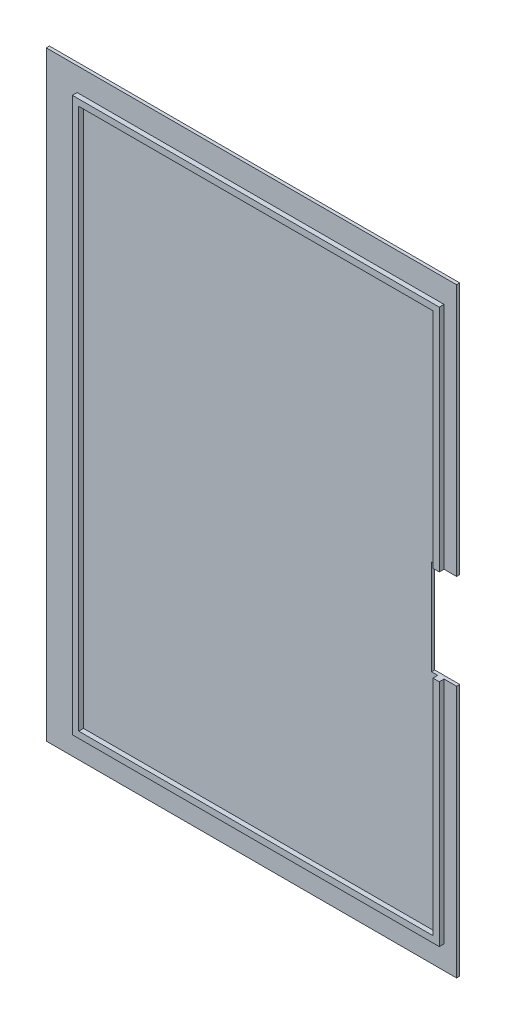
ISO-10303-21;
HEADER;
FILE_DESCRIPTION(('STEP AP214'),'2;1');
FILE_NAME('part.step','',(''),(''),'','','');
FILE_SCHEMA(('AUTOMOTIVE_DESIGN { 1 0 10303 214 1 1 1 1 }'));
ENDSEC;
DATA;
#1=APPLICATION_CONTEXT('core data for automotive mechanical design processes');
#2=APPLICATION_PROTOCOL_DEFINITION('international standard','automotive_design',2000,#1);
#3=PRODUCT_CONTEXT('',#1,'mechanical');
#4=PRODUCT('Part','Part','',(#3));
#5=PRODUCT_RELATED_PRODUCT_CATEGORY('part','',(#4));
#6=PRODUCT_DEFINITION_FORMATION('','',#4);
#7=PRODUCT_DEFINITION_CONTEXT('part definition',#1,'design');
#8=PRODUCT_DEFINITION('design','',#6,#7);
#9=PRODUCT_DEFINITION_SHAPE('','',#8);
#10=(LENGTH_UNIT() NAMED_UNIT(*) SI_UNIT(.MILLI.,.METRE.));
#11=(NAMED_UNIT(*) PLANE_ANGLE_UNIT() SI_UNIT($,.RADIAN.));
#12=(NAMED_UNIT(*) SI_UNIT($,.STERADIAN.) SOLID_ANGLE_UNIT());
#13=UNCERTAINTY_MEASURE_WITH_UNIT(LENGTH_MEASURE(1.E-05),#10,'distance_accuracy_value','');
#14=(GEOMETRIC_REPRESENTATION_CONTEXT(3) GLOBAL_UNCERTAINTY_ASSIGNED_CONTEXT((#13)) GLOBAL_UNIT_ASSIGNED_CONTEXT((#10,
#11,#12)) REPRESENTATION_CONTEXT('',''));
#15=CARTESIAN_POINT('',(0.,0.,0.));
#16=DIRECTION('',(0.,0.,1.));
#17=DIRECTION('',(1.,0.,0.));
#18=AXIS2_PLACEMENT_3D('',#15,#16,#17);
#19=CARTESIAN_POINT('',(64.75,94.75,1.));
#20=DIRECTION('',(-1.,0.,0.));
#21=DIRECTION('',(0.,0.,1.));
#22=AXIS2_PLACEMENT_3D('',#19,#20,#21);
#23=PLANE('',#22);
#24=DIRECTION('',(0.,1.,0.));
#25=VECTOR('',#24,1.);
#26=CARTESIAN_POINT('',(64.75,94.75,0.));
#27=LINE('',#26,#25);
#28=CARTESIAN_POINT('',(64.75,-94.75,0.));
#29=VERTEX_POINT('',#28);
#30=CARTESIAN_POINT('',(64.75,-15.,0.));
#31=VERTEX_POINT('',#30);
#32=EDGE_CURVE('E238',#29,#31,#27,.T.);
#33=ORIENTED_EDGE('',*,*,#32,.T.);
#34=DIRECTION('',(0.,0.,1.));
#35=VECTOR('',#34,1.);
#36=CARTESIAN_POINT('',(64.75,-15.,-0.5));
#37=LINE('',#36,#35);
#38=CARTESIAN_POINT('',(64.75,-15.,1.));
#39=VERTEX_POINT('',#38);
#40=EDGE_CURVE('E276',#31,#39,#37,.T.);
#41=ORIENTED_EDGE('',*,*,#40,.T.);
#42=DIRECTION('',(0.,1.,0.));
#43=VECTOR('',#42,1.);
#44=CARTESIAN_POINT('',(64.75,94.75,1.));
#45=LINE('',#44,#43);
#46=CARTESIAN_POINT('',(64.75,-94.75,1.));
#47=VERTEX_POINT('',#46);
#48=EDGE_CURVE('E227',#47,#39,#45,.T.);
#49=ORIENTED_EDGE('',*,*,#48,.F.);
#50=DIRECTION('',(0.,0.,-1.));
#51=VECTOR('',#50,1.);
#52=CARTESIAN_POINT('',(64.75,-94.75,1.));
#53=LINE('',#52,#51);
#54=EDGE_CURVE('E237',#47,#29,#53,.T.);
#55=ORIENTED_EDGE('',*,*,#54,.T.);
#56=EDGE_LOOP('',(#33,#41,#49,#55));
#57=FACE_BOUND('',#56,.T.);
#58=ADVANCED_FACE('F36',(#57),#23,.F.);
#59=CARTESIAN_POINT('',(60.8,87.4,2.5));
#60=DIRECTION('',(-1.,0.,0.));
#61=DIRECTION('',(0.,0.,1.));
#62=AXIS2_PLACEMENT_3D('',#59,#60,#61);
#63=PLANE('',#62);
#64=DIRECTION('',(0.,1.,0.));
#65=VECTOR('',#64,1.);
#66=CARTESIAN_POINT('',(60.8,87.4,1.));
#67=LINE('',#66,#65);
#68=CARTESIAN_POINT('',(60.8,-87.4,1.));
#69=VERTEX_POINT('',#68);
#70=CARTESIAN_POINT('',(60.8,-15.,1.));
#71=VERTEX_POINT('',#70);
#72=EDGE_CURVE('E212',#69,#71,#67,.T.);
#73=ORIENTED_EDGE('',*,*,#72,.T.);
#74=DIRECTION('',(0.,0.,1.));
#75=VECTOR('',#74,1.);
#76=CARTESIAN_POINT('',(60.8,-15.,2.5));
#77=LINE('',#76,#75);
#78=CARTESIAN_POINT('',(60.8,-15.,2.5));
#79=VERTEX_POINT('',#78);
#80=EDGE_CURVE('E331',#71,#79,#77,.T.);
#81=ORIENTED_EDGE('',*,*,#80,.T.);
#82=DIRECTION('',(0.,1.,0.));
#83=VECTOR('',#82,1.);
#84=CARTESIAN_POINT('',(60.8,87.4,2.5));
#85=LINE('',#84,#83);
#86=CARTESIAN_POINT('',(60.8,-87.4,2.5));
#87=VERTEX_POINT('',#86);
#88=EDGE_CURVE('E195',#87,#79,#85,.T.);
#89=ORIENTED_EDGE('',*,*,#88,.F.);
#90=DIRECTION('',(0.,0.,-1.));
#91=VECTOR('',#90,1.);
#92=CARTESIAN_POINT('',(60.8,-87.4,2.5));
#93=LINE('',#92,#91);
#94=EDGE_CURVE('E211',#87,#69,#93,.T.);
#95=ORIENTED_EDGE('',*,*,#94,.T.);
#96=EDGE_LOOP('',(#73,#81,#89,#95));
#97=FACE_BOUND('',#96,.T.);
#98=ADVANCED_FACE('F330',(#97),#63,.F.);
#99=CARTESIAN_POINT('',(58.8,85.4,2.5));
#100=DIRECTION('',(-1.,0.,0.));
#101=DIRECTION('',(0.,0.,1.));
#102=AXIS2_PLACEMENT_3D('',#99,#100,#101);
#103=PLANE('',#102);
#104=DIRECTION('',(0.,0.,1.));
#105=VECTOR('',#104,1.);
#106=CARTESIAN_POINT('',(58.8,-15.,2.5));
#107=LINE('',#106,#105);
#108=CARTESIAN_POINT('',(58.8,-15.,1.));
#109=VERTEX_POINT('',#108);
#110=CARTESIAN_POINT('',(58.8,-15.,2.5));
#111=VERTEX_POINT('',#110);
#112=EDGE_CURVE('E333',#109,#111,#107,.T.);
#113=ORIENTED_EDGE('',*,*,#112,.F.);
#114=DIRECTION('',(0.,1.,0.));
#115=VECTOR('',#114,1.);
#116=CARTESIAN_POINT('',(58.8,85.4,1.));
#117=LINE('',#116,#115);
#118=CARTESIAN_POINT('',(58.8,-85.4,1.));
#119=VERTEX_POINT('',#118);
#120=EDGE_CURVE('E281',#119,#109,#117,.T.);
#121=ORIENTED_EDGE('',*,*,#120,.F.);
#122=DIRECTION('',(0.,0.,-1.));
#123=VECTOR('',#122,1.);
#124=CARTESIAN_POINT('',(58.8,-85.4,2.5));
#125=LINE('',#124,#123);
#126=CARTESIAN_POINT('',(58.8,-85.4,2.5));
#127=VERTEX_POINT('',#126);
#128=EDGE_CURVE('E298',#127,#119,#125,.T.);
#129=ORIENTED_EDGE('',*,*,#128,.F.);
#130=DIRECTION('',(0.,1.,0.));
#131=VECTOR('',#130,1.);
#132=CARTESIAN_POINT('',(58.8,85.4,2.5));
#133=LINE('',#132,#131);
#134=EDGE_CURVE('E341',#127,#111,#133,.T.);
#135=ORIENTED_EDGE('',*,*,#134,.T.);
#136=EDGE_LOOP('',(#113,#121,#129,#135));
#137=FACE_BOUND('',#136,.T.);
#138=ADVANCED_FACE('F353',(#137),#103,.T.);
#139=CARTESIAN_POINT('',(0.,0.,1.));
#140=DIRECTION('',(0.,0.,1.));
#141=DIRECTION('',(1.,0.,0.));
#142=AXIS2_PLACEMENT_3D('',#139,#140,#141);
#143=PLANE('',#142);
#144=DIRECTION('',(1.,0.,0.));
#145=VECTOR('',#144,1.);
#146=CARTESIAN_POINT('',(0.,-15.,1.));
#147=LINE('',#146,#145);
#148=EDGE_CURVE('E332',#71,#39,#147,.T.);
#149=ORIENTED_EDGE('',*,*,#148,.F.);
#150=ORIENTED_EDGE('',*,*,#72,.F.);
#151=DIRECTION('',(1.,0.,0.));
#152=VECTOR('',#151,1.);
#153=CARTESIAN_POINT('',(-55.,-87.4,1.));
#154=LINE('',#153,#152);
#155=CARTESIAN_POINT('',(-55.,-87.4,1.));
#156=VERTEX_POINT('',#155);
#157=EDGE_CURVE('E196',#156,#69,#154,.T.);
#158=ORIENTED_EDGE('',*,*,#157,.F.);
#159=DIRECTION('',(0.,-1.,0.));
#160=VECTOR('',#159,1.);
#161=CARTESIAN_POINT('',(-55.,87.4,1.));
#162=LINE('',#161,#160);
#163=CARTESIAN_POINT('',(-55.,87.4,1.));
#164=VERTEX_POINT('',#163);
#165=EDGE_CURVE('E200',#164,#156,#162,.T.);
#166=ORIENTED_EDGE('',*,*,#165,.F.);
#167=DIRECTION('',(-1.,0.,0.));
#168=VECTOR('',#167,1.);
#169=CARTESIAN_POINT('',(-55.,87.4,1.));
#170=LINE('',#169,#168);
#171=CARTESIAN_POINT('',(60.8,87.4,1.));
#172=VERTEX_POINT('',#171);
#173=EDGE_CURVE('E215',#172,#164,#170,.T.);
#174=ORIENTED_EDGE('',*,*,#173,.F.);
#175=CARTESIAN_POINT('',(60.8,15.,1.));
#176=VERTEX_POINT('',#175);
#177=EDGE_CURVE('E216',#176,#172,#67,.T.);
#178=ORIENTED_EDGE('',*,*,#177,.F.);
#179=DIRECTION('',(-1.,0.,0.));
#180=VECTOR('',#179,1.);
#181=CARTESIAN_POINT('',(0.,15.,1.));
#182=LINE('',#181,#180);
#183=CARTESIAN_POINT('',(64.75,15.,1.));
#184=VERTEX_POINT('',#183);
#185=EDGE_CURVE('E176',#184,#176,#182,.T.);
#186=ORIENTED_EDGE('',*,*,#185,.F.);
#187=CARTESIAN_POINT('',(64.75,94.75,1.));
#188=VERTEX_POINT('',#187);
#189=EDGE_CURVE('E231',#184,#188,#45,.T.);
#190=ORIENTED_EDGE('',*,*,#189,.T.);
#191=DIRECTION('',(-1.,0.,0.));
#192=VECTOR('',#191,1.);
#193=CARTESIAN_POINT('',(-64.75,94.75,1.));
#194=LINE('',#193,#192);
#195=CARTESIAN_POINT('',(-64.75,94.75,1.));
#196=VERTEX_POINT('',#195);
#197=EDGE_CURVE('E230',#188,#196,#194,.T.);
#198=ORIENTED_EDGE('',*,*,#197,.T.);
#199=DIRECTION('',(0.,-1.,0.));
#200=VECTOR('',#199,1.);
#201=CARTESIAN_POINT('',(-64.75,94.75,1.));
#202=LINE('',#201,#200);
#203=CARTESIAN_POINT('',(-64.75,-94.75,1.));
#204=VERTEX_POINT('',#203);
#205=EDGE_CURVE('E233',#196,#204,#202,.T.);
#206=ORIENTED_EDGE('',*,*,#205,.T.);
#207=DIRECTION('',(1.,0.,0.));
#208=VECTOR('',#207,1.);
#209=CARTESIAN_POINT('',(-64.75,-94.75,1.));
#210=LINE('',#209,#208);
#211=EDGE_CURVE('E235',#204,#47,#210,.T.);
#212=ORIENTED_EDGE('',*,*,#211,.T.);
#213=ORIENTED_EDGE('',*,*,#48,.T.);
#214=EDGE_LOOP('',(#149,#150,#158,#166,#174,#178,#186,#190,#198,#206,#212,#213));
#215=FACE_BOUND('',#214,.T.);
#216=ADVANCED_FACE('F319',(#215),#143,.T.);
#217=ORIENTED_EDGE('',*,*,#189,.F.);
#218=DIRECTION('',(0.,0.,1.));
#219=VECTOR('',#218,1.);
#220=CARTESIAN_POINT('',(64.75,15.,-0.5));
#221=LINE('',#220,#219);
#222=CARTESIAN_POINT('',(64.75,15.,0.));
#223=VERTEX_POINT('',#222);
#224=EDGE_CURVE('E354',#223,#184,#221,.T.);
#225=ORIENTED_EDGE('',*,*,#224,.F.);
#226=CARTESIAN_POINT('',(64.75,94.75,0.));
#227=VERTEX_POINT('',#226);
#228=EDGE_CURVE('E226',#223,#227,#27,.T.);
#229=ORIENTED_EDGE('',*,*,#228,.T.);
#230=DIRECTION('',(0.,0.,-1.));
#231=VECTOR('',#230,1.);
#232=CARTESIAN_POINT('',(64.75,94.75,1.));
#233=LINE('',#232,#231);
#234=EDGE_CURVE('E255',#188,#227,#233,.T.);
#235=ORIENTED_EDGE('',*,*,#234,.F.);
#236=EDGE_LOOP('',(#217,#225,#229,#235));
#237=FACE_BOUND('',#236,.T.);
#238=ADVANCED_FACE('F38',(#237),#23,.F.);
#239=CARTESIAN_POINT('',(-64.75,94.75,1.));
#240=DIRECTION('',(0.,-1.,0.));
#241=DIRECTION('',(0.,0.,-1.));
#242=AXIS2_PLACEMENT_3D('',#239,#240,#241);
#243=PLANE('',#242);
#244=DIRECTION('',(-1.,0.,0.));
#245=VECTOR('',#244,1.);
#246=CARTESIAN_POINT('',(-64.75,94.75,0.));
#247=LINE('',#246,#245);
#248=CARTESIAN_POINT('',(-64.75,94.75,0.));
#249=VERTEX_POINT('',#248);
#250=EDGE_CURVE('E241',#227,#249,#247,.T.);
#251=ORIENTED_EDGE('',*,*,#250,.T.);
#252=DIRECTION('',(0.,0.,-1.));
#253=VECTOR('',#252,1.);
#254=CARTESIAN_POINT('',(-64.75,94.75,1.));
#255=LINE('',#254,#253);
#256=EDGE_CURVE('E252',#196,#249,#255,.T.);
#257=ORIENTED_EDGE('',*,*,#256,.F.);
#258=ORIENTED_EDGE('',*,*,#197,.F.);
#259=ORIENTED_EDGE('',*,*,#234,.T.);
#260=EDGE_LOOP('',(#251,#257,#258,#259));
#261=FACE_BOUND('',#260,.T.);
#262=ADVANCED_FACE('F388',(#261),#243,.F.);
#263=CARTESIAN_POINT('',(-64.75,94.75,1.));
#264=DIRECTION('',(1.,0.,0.));
#265=DIRECTION('',(0.,1.,0.));
#266=AXIS2_PLACEMENT_3D('',#263,#264,#265);
#267=PLANE('',#266);
#268=DIRECTION('',(0.,-1.,0.));
#269=VECTOR('',#268,1.);
#270=CARTESIAN_POINT('',(-64.75,94.75,0.));
#271=LINE('',#270,#269);
#272=CARTESIAN_POINT('',(-64.75,-94.75,0.));
#273=VERTEX_POINT('',#272);
#274=EDGE_CURVE('E243',#249,#273,#271,.T.);
#275=ORIENTED_EDGE('',*,*,#274,.T.);
#276=DIRECTION('',(0.,0.,-1.));
#277=VECTOR('',#276,1.);
#278=CARTESIAN_POINT('',(-64.75,-94.75,1.));
#279=LINE('',#278,#277);
#280=EDGE_CURVE('E249',#204,#273,#279,.T.);
#281=ORIENTED_EDGE('',*,*,#280,.F.);
#282=ORIENTED_EDGE('',*,*,#205,.F.);
#283=ORIENTED_EDGE('',*,*,#256,.T.);
#284=EDGE_LOOP('',(#275,#281,#282,#283));
#285=FACE_BOUND('',#284,.T.);
#286=ADVANCED_FACE('F394',(#285),#267,.F.);
#287=CARTESIAN_POINT('',(-64.75,-94.75,1.));
#288=DIRECTION('',(0.,1.,0.));
#289=DIRECTION('',(0.,0.,1.));
#290=AXIS2_PLACEMENT_3D('',#287,#288,#289);
#291=PLANE('',#290);
#292=DIRECTION('',(1.,0.,0.));
#293=VECTOR('',#292,1.);
#294=CARTESIAN_POINT('',(-64.75,-94.75,0.));
#295=LINE('',#294,#293);
#296=EDGE_CURVE('E245',#273,#29,#295,.T.);
#297=ORIENTED_EDGE('',*,*,#296,.T.);
#298=ORIENTED_EDGE('',*,*,#54,.F.);
#299=ORIENTED_EDGE('',*,*,#211,.F.);
#300=ORIENTED_EDGE('',*,*,#280,.T.);
#301=EDGE_LOOP('',(#297,#298,#299,#300));
#302=FACE_BOUND('',#301,.T.);
#303=ADVANCED_FACE('F410',(#302),#291,.F.);
#304=CARTESIAN_POINT('',(0.,0.,0.));
#305=DIRECTION('',(0.,0.,1.));
#306=DIRECTION('',(1.,0.,0.));
#307=AXIS2_PLACEMENT_3D('',#304,#305,#306);
#308=PLANE('',#307);
#309=DIRECTION('',(0.,-1.,0.));
#310=VECTOR('',#309,1.);
#311=CARTESIAN_POINT('',(56.85,0.,0.));
#312=LINE('',#311,#310);
#313=CARTESIAN_POINT('',(56.85,15.,0.));
#314=VERTEX_POINT('',#313);
#315=CARTESIAN_POINT('',(56.85,-15.,0.));
#316=VERTEX_POINT('',#315);
#317=EDGE_CURVE('E336',#314,#316,#312,.T.);
#318=ORIENTED_EDGE('',*,*,#317,.T.);
#319=DIRECTION('',(1.,0.,0.));
#320=VECTOR('',#319,1.);
#321=CARTESIAN_POINT('',(0.,-15.,0.));
#322=LINE('',#321,#320);
#323=EDGE_CURVE('E275',#316,#31,#322,.T.);
#324=ORIENTED_EDGE('',*,*,#323,.T.);
#325=ORIENTED_EDGE('',*,*,#32,.F.);
#326=ORIENTED_EDGE('',*,*,#296,.F.);
#327=ORIENTED_EDGE('',*,*,#274,.F.);
#328=ORIENTED_EDGE('',*,*,#250,.F.);
#329=ORIENTED_EDGE('',*,*,#228,.F.);
#330=DIRECTION('',(-1.,0.,0.));
#331=VECTOR('',#330,1.);
#332=CARTESIAN_POINT('',(0.,15.,0.));
#333=LINE('',#332,#331);
#334=EDGE_CURVE('E363',#223,#314,#333,.T.);
#335=ORIENTED_EDGE('',*,*,#334,.T.);
#336=EDGE_LOOP('',(#318,#324,#325,#326,#327,#328,#329,#335));
#337=FACE_BOUND('',#336,.T.);
#338=ADVANCED_FACE('F366',(#337),#308,.F.);
#339=CARTESIAN_POINT('',(0.,0.,2.5));
#340=DIRECTION('',(0.,0.,1.));
#341=DIRECTION('',(1.,0.,0.));
#342=AXIS2_PLACEMENT_3D('',#339,#340,#341);
#343=PLANE('',#342);
#344=DIRECTION('',(1.,0.,0.));
#345=VECTOR('',#344,1.);
#346=CARTESIAN_POINT('',(56.85,-15.,2.5));
#347=LINE('',#346,#345);
#348=EDGE_CURVE('E189',#111,#79,#347,.T.);
#349=ORIENTED_EDGE('',*,*,#348,.F.);
#350=ORIENTED_EDGE('',*,*,#134,.F.);
#351=DIRECTION('',(1.,0.,0.));
#352=VECTOR('',#351,1.);
#353=CARTESIAN_POINT('',(-53.,-85.4,2.5));
#354=LINE('',#353,#352);
#355=CARTESIAN_POINT('',(-53.,-85.4,2.5));
#356=VERTEX_POINT('',#355);
#357=EDGE_CURVE('E293',#356,#127,#354,.T.);
#358=ORIENTED_EDGE('',*,*,#357,.F.);
#359=DIRECTION('',(0.,-1.,0.));
#360=VECTOR('',#359,1.);
#361=CARTESIAN_POINT('',(-53.,85.4,2.5));
#362=LINE('',#361,#360);
#363=CARTESIAN_POINT('',(-53.,85.4,2.5));
#364=VERTEX_POINT('',#363);
#365=EDGE_CURVE('E345',#364,#356,#362,.T.);
#366=ORIENTED_EDGE('',*,*,#365,.F.);
#367=DIRECTION('',(-1.,0.,0.));
#368=VECTOR('',#367,1.);
#369=CARTESIAN_POINT('',(-53.,85.4,2.5));
#370=LINE('',#369,#368);
#371=CARTESIAN_POINT('',(58.8,85.4,2.5));
#372=VERTEX_POINT('',#371);
#373=EDGE_CURVE('E344',#372,#364,#370,.T.);
#374=ORIENTED_EDGE('',*,*,#373,.F.);
#375=CARTESIAN_POINT('',(58.8,15.,2.5));
#376=VERTEX_POINT('',#375);
#377=EDGE_CURVE('E188',#376,#372,#133,.T.);
#378=ORIENTED_EDGE('',*,*,#377,.F.);
#379=DIRECTION('',(-1.,0.,0.));
#380=VECTOR('',#379,1.);
#381=CARTESIAN_POINT('',(56.85,15.,2.5));
#382=LINE('',#381,#380);
#383=CARTESIAN_POINT('',(60.8,15.,2.5));
#384=VERTEX_POINT('',#383);
#385=EDGE_CURVE('E174',#384,#376,#382,.T.);
#386=ORIENTED_EDGE('',*,*,#385,.F.);
#387=CARTESIAN_POINT('',(60.8,87.4,2.5));
#388=VERTEX_POINT('',#387);
#389=EDGE_CURVE('E185',#384,#388,#85,.T.);
#390=ORIENTED_EDGE('',*,*,#389,.T.);
#391=DIRECTION('',(-1.,0.,0.));
#392=VECTOR('',#391,1.);
#393=CARTESIAN_POINT('',(-55.,87.4,2.5));
#394=LINE('',#393,#392);
#395=CARTESIAN_POINT('',(-55.,87.4,2.5));
#396=VERTEX_POINT('',#395);
#397=EDGE_CURVE('E199',#388,#396,#394,.T.);
#398=ORIENTED_EDGE('',*,*,#397,.T.);
#399=DIRECTION('',(0.,-1.,0.));
#400=VECTOR('',#399,1.);
#401=CARTESIAN_POINT('',(-55.,87.4,2.5));
#402=LINE('',#401,#400);
#403=CARTESIAN_POINT('',(-55.,-87.4,2.5));
#404=VERTEX_POINT('',#403);
#405=EDGE_CURVE('E207',#396,#404,#402,.T.);
#406=ORIENTED_EDGE('',*,*,#405,.T.);
#407=DIRECTION('',(1.,0.,0.));
#408=VECTOR('',#407,1.);
#409=CARTESIAN_POINT('',(-55.,-87.4,2.5));
#410=LINE('',#409,#408);
#411=EDGE_CURVE('E209',#404,#87,#410,.T.);
#412=ORIENTED_EDGE('',*,*,#411,.T.);
#413=ORIENTED_EDGE('',*,*,#88,.T.);
#414=EDGE_LOOP('',(#349,#350,#358,#366,#374,#378,#386,#390,#398,#406,#412,#413));
#415=FACE_BOUND('',#414,.T.);
#416=ADVANCED_FACE('F184',(#415),#343,.T.);
#417=ORIENTED_EDGE('',*,*,#389,.F.);
#418=DIRECTION('',(0.,0.,-1.));
#419=VECTOR('',#418,1.);
#420=CARTESIAN_POINT('',(60.8,15.,2.5));
#421=LINE('',#420,#419);
#422=EDGE_CURVE('E171',#384,#176,#421,.T.);
#423=ORIENTED_EDGE('',*,*,#422,.T.);
#424=ORIENTED_EDGE('',*,*,#177,.T.);
#425=DIRECTION('',(0.,0.,-1.));
#426=VECTOR('',#425,1.);
#427=CARTESIAN_POINT('',(60.8,87.4,2.5));
#428=LINE('',#427,#426);
#429=EDGE_CURVE('E194',#388,#172,#428,.T.);
#430=ORIENTED_EDGE('',*,*,#429,.F.);
#431=EDGE_LOOP('',(#417,#423,#424,#430));
#432=FACE_BOUND('',#431,.T.);
#433=ADVANCED_FACE('F192',(#432),#63,.F.);
#434=CARTESIAN_POINT('',(-55.,87.4,2.5));
#435=DIRECTION('',(0.,-1.,0.));
#436=DIRECTION('',(0.,0.,-1.));
#437=AXIS2_PLACEMENT_3D('',#434,#435,#436);
#438=PLANE('',#437);
#439=ORIENTED_EDGE('',*,*,#173,.T.);
#440=DIRECTION('',(0.,0.,-1.));
#441=VECTOR('',#440,1.);
#442=CARTESIAN_POINT('',(-55.,87.4,2.5));
#443=LINE('',#442,#441);
#444=EDGE_CURVE('E222',#396,#164,#443,.T.);
#445=ORIENTED_EDGE('',*,*,#444,.F.);
#446=ORIENTED_EDGE('',*,*,#397,.F.);
#447=ORIENTED_EDGE('',*,*,#429,.T.);
#448=EDGE_LOOP('',(#439,#445,#446,#447));
#449=FACE_BOUND('',#448,.T.);
#450=ADVANCED_FACE('F315',(#449),#438,.F.);
#451=CARTESIAN_POINT('',(-55.,87.4,2.5));
#452=DIRECTION('',(1.,0.,0.));
#453=DIRECTION('',(0.,0.,-1.));
#454=AXIS2_PLACEMENT_3D('',#451,#452,#453);
#455=PLANE('',#454);
#456=ORIENTED_EDGE('',*,*,#165,.T.);
#457=DIRECTION('',(0.,0.,-1.));
#458=VECTOR('',#457,1.);
#459=CARTESIAN_POINT('',(-55.,-87.4,2.5));
#460=LINE('',#459,#458);
#461=EDGE_CURVE('E59',#404,#156,#460,.T.);
#462=ORIENTED_EDGE('',*,*,#461,.F.);
#463=ORIENTED_EDGE('',*,*,#405,.F.);
#464=ORIENTED_EDGE('',*,*,#444,.T.);
#465=EDGE_LOOP('',(#456,#462,#463,#464));
#466=FACE_BOUND('',#465,.T.);
#467=ADVANCED_FACE('F323',(#466),#455,.F.);
#468=CARTESIAN_POINT('',(-55.,-87.4,2.5));
#469=DIRECTION('',(0.,1.,0.));
#470=DIRECTION('',(0.,0.,1.));
#471=AXIS2_PLACEMENT_3D('',#468,#469,#470);
#472=PLANE('',#471);
#473=ORIENTED_EDGE('',*,*,#157,.T.);
#474=ORIENTED_EDGE('',*,*,#94,.F.);
#475=ORIENTED_EDGE('',*,*,#411,.F.);
#476=ORIENTED_EDGE('',*,*,#461,.T.);
#477=EDGE_LOOP('',(#473,#474,#475,#476));
#478=FACE_BOUND('',#477,.T.);
#479=ADVANCED_FACE('F327',(#478),#472,.F.);
#480=DIRECTION('',(0.,0.,-1.));
#481=VECTOR('',#480,1.);
#482=CARTESIAN_POINT('',(58.8,15.,2.5));
#483=LINE('',#482,#481);
#484=CARTESIAN_POINT('',(58.8,15.,1.));
#485=VERTEX_POINT('',#484);
#486=EDGE_CURVE('E51',#376,#485,#483,.T.);
#487=ORIENTED_EDGE('',*,*,#486,.F.);
#488=ORIENTED_EDGE('',*,*,#377,.T.);
#489=DIRECTION('',(0.,0.,-1.));
#490=VECTOR('',#489,1.);
#491=CARTESIAN_POINT('',(58.8,85.4,2.5));
#492=LINE('',#491,#490);
#493=CARTESIAN_POINT('',(58.8,85.4,1.));
#494=VERTEX_POINT('',#493);
#495=EDGE_CURVE('E204',#372,#494,#492,.T.);
#496=ORIENTED_EDGE('',*,*,#495,.T.);
#497=EDGE_CURVE('E288',#485,#494,#117,.T.);
#498=ORIENTED_EDGE('',*,*,#497,.F.);
#499=EDGE_LOOP('',(#487,#488,#496,#498));
#500=FACE_BOUND('',#499,.T.);
#501=ADVANCED_FACE('F370',(#500),#103,.T.);
#502=CARTESIAN_POINT('',(-53.,85.4,2.5));
#503=DIRECTION('',(0.,-1.,0.));
#504=DIRECTION('',(0.,0.,-1.));
#505=AXIS2_PLACEMENT_3D('',#502,#503,#504);
#506=PLANE('',#505);
#507=DIRECTION('',(-1.,0.,0.));
#508=VECTOR('',#507,1.);
#509=CARTESIAN_POINT('',(-53.,85.4,1.));
#510=LINE('',#509,#508);
#511=CARTESIAN_POINT('',(-53.,85.4,1.));
#512=VERTEX_POINT('',#511);
#513=EDGE_CURVE('E287',#494,#512,#510,.T.);
#514=ORIENTED_EDGE('',*,*,#513,.F.);
#515=ORIENTED_EDGE('',*,*,#495,.F.);
#516=ORIENTED_EDGE('',*,*,#373,.T.);
#517=DIRECTION('',(0.,0.,-1.));
#518=VECTOR('',#517,1.);
#519=CARTESIAN_POINT('',(-53.,85.4,2.5));
#520=LINE('',#519,#518);
#521=EDGE_CURVE('E302',#364,#512,#520,.T.);
#522=ORIENTED_EDGE('',*,*,#521,.T.);
#523=EDGE_LOOP('',(#514,#515,#516,#522));
#524=FACE_BOUND('',#523,.T.);
#525=ADVANCED_FACE('F371',(#524),#506,.T.);
#526=CARTESIAN_POINT('',(-53.,85.4,2.5));
#527=DIRECTION('',(1.,0.,0.));
#528=DIRECTION('',(0.,0.,-1.));
#529=AXIS2_PLACEMENT_3D('',#526,#527,#528);
#530=PLANE('',#529);
#531=DIRECTION('',(0.,-1.,0.));
#532=VECTOR('',#531,1.);
#533=CARTESIAN_POINT('',(-53.,85.4,1.));
#534=LINE('',#533,#532);
#535=CARTESIAN_POINT('',(-53.,-85.4,1.));
#536=VERTEX_POINT('',#535);
#537=EDGE_CURVE('E290',#512,#536,#534,.T.);
#538=ORIENTED_EDGE('',*,*,#537,.F.);
#539=ORIENTED_EDGE('',*,*,#521,.F.);
#540=ORIENTED_EDGE('',*,*,#365,.T.);
#541=DIRECTION('',(0.,0.,-1.));
#542=VECTOR('',#541,1.);
#543=CARTESIAN_POINT('',(-53.,-85.4,2.5));
#544=LINE('',#543,#542);
#545=EDGE_CURVE('E300',#356,#536,#544,.T.);
#546=ORIENTED_EDGE('',*,*,#545,.T.);
#547=EDGE_LOOP('',(#538,#539,#540,#546));
#548=FACE_BOUND('',#547,.T.);
#549=ADVANCED_FACE('F372',(#548),#530,.T.);
#550=CARTESIAN_POINT('',(-53.,-85.4,2.5));
#551=DIRECTION('',(0.,1.,0.));
#552=DIRECTION('',(0.,0.,1.));
#553=AXIS2_PLACEMENT_3D('',#550,#551,#552);
#554=PLANE('',#553);
#555=DIRECTION('',(1.,0.,0.));
#556=VECTOR('',#555,1.);
#557=CARTESIAN_POINT('',(-53.,-85.4,1.));
#558=LINE('',#557,#556);
#559=EDGE_CURVE('E283',#536,#119,#558,.T.);
#560=ORIENTED_EDGE('',*,*,#559,.F.);
#561=ORIENTED_EDGE('',*,*,#545,.F.);
#562=ORIENTED_EDGE('',*,*,#357,.T.);
#563=ORIENTED_EDGE('',*,*,#128,.T.);
#564=EDGE_LOOP('',(#560,#561,#562,#563));
#565=FACE_BOUND('',#564,.T.);
#566=ADVANCED_FACE('F351',(#565),#554,.T.);
#567=DIRECTION('',(1.,0.,0.));
#568=VECTOR('',#567,1.);
#569=CARTESIAN_POINT('',(0.,-15.,1.));
#570=LINE('',#569,#568);
#571=CARTESIAN_POINT('',(56.85,-15.,1.));
#572=VERTEX_POINT('',#571);
#573=EDGE_CURVE('E11',#572,#109,#570,.T.);
#574=ORIENTED_EDGE('',*,*,#573,.F.);
#575=DIRECTION('',(0.,-1.,0.));
#576=VECTOR('',#575,1.);
#577=CARTESIAN_POINT('',(56.85,0.,1.));
#578=LINE('',#577,#576);
#579=CARTESIAN_POINT('',(56.85,15.,1.));
#580=VERTEX_POINT('',#579);
#581=EDGE_CURVE('E44',#580,#572,#578,.T.);
#582=ORIENTED_EDGE('',*,*,#581,.F.);
#583=DIRECTION('',(-1.,0.,0.));
#584=VECTOR('',#583,1.);
#585=CARTESIAN_POINT('',(0.,15.,1.));
#586=LINE('',#585,#584);
#587=EDGE_CURVE('E258',#485,#580,#586,.T.);
#588=ORIENTED_EDGE('',*,*,#587,.F.);
#589=ORIENTED_EDGE('',*,*,#497,.T.);
#590=ORIENTED_EDGE('',*,*,#513,.T.);
#591=ORIENTED_EDGE('',*,*,#537,.T.);
#592=ORIENTED_EDGE('',*,*,#559,.T.);
#593=ORIENTED_EDGE('',*,*,#120,.T.);
#594=EDGE_LOOP('',(#574,#582,#588,#589,#590,#591,#592,#593));
#595=FACE_BOUND('',#594,.T.);
#596=ADVANCED_FACE('F279',(#595),#143,.T.);
#597=CARTESIAN_POINT('',(56.85,-15.,-0.5));
#598=DIRECTION('',(0.,-1.,0.));
#599=DIRECTION('',(0.,0.,-1.));
#600=AXIS2_PLACEMENT_3D('',#597,#598,#599);
#601=PLANE('',#600);
#602=DIRECTION('',(0.,0.,1.));
#603=VECTOR('',#602,1.);
#604=CARTESIAN_POINT('',(56.85,-15.,-0.5));
#605=LINE('',#604,#603);
#606=EDGE_CURVE('E265',#316,#572,#605,.T.);
#607=ORIENTED_EDGE('',*,*,#606,.T.);
#608=ORIENTED_EDGE('',*,*,#573,.T.);
#609=ORIENTED_EDGE('',*,*,#112,.T.);
#610=ORIENTED_EDGE('',*,*,#348,.T.);
#611=ORIENTED_EDGE('',*,*,#80,.F.);
#612=ORIENTED_EDGE('',*,*,#148,.T.);
#613=ORIENTED_EDGE('',*,*,#40,.F.);
#614=ORIENTED_EDGE('',*,*,#323,.F.);
#615=EDGE_LOOP('',(#607,#608,#609,#610,#611,#612,#613,#614));
#616=FACE_BOUND('',#615,.T.);
#617=ADVANCED_FACE('F272',(#616),#601,.F.);
#618=CARTESIAN_POINT('',(56.85,15.,-0.5));
#619=DIRECTION('',(-1.,0.,0.));
#620=DIRECTION('',(0.,0.,1.));
#621=AXIS2_PLACEMENT_3D('',#618,#619,#620);
#622=PLANE('',#621);
#623=DIRECTION('',(0.,0.,1.));
#624=VECTOR('',#623,1.);
#625=CARTESIAN_POINT('',(56.85,15.,-0.5));
#626=LINE('',#625,#624);
#627=EDGE_CURVE('E268',#314,#580,#626,.T.);
#628=ORIENTED_EDGE('',*,*,#627,.T.);
#629=ORIENTED_EDGE('',*,*,#581,.T.);
#630=ORIENTED_EDGE('',*,*,#606,.F.);
#631=ORIENTED_EDGE('',*,*,#317,.F.);
#632=EDGE_LOOP('',(#628,#629,#630,#631));
#633=FACE_BOUND('',#632,.T.);
#634=ADVANCED_FACE('F264',(#633),#622,.F.);
#635=CARTESIAN_POINT('',(56.85,15.,-0.5));
#636=DIRECTION('',(0.,1.,0.));
#637=DIRECTION('',(0.,0.,1.));
#638=AXIS2_PLACEMENT_3D('',#635,#636,#637);
#639=PLANE('',#638);
#640=ORIENTED_EDGE('',*,*,#224,.T.);
#641=ORIENTED_EDGE('',*,*,#185,.T.);
#642=ORIENTED_EDGE('',*,*,#422,.F.);
#643=ORIENTED_EDGE('',*,*,#385,.T.);
#644=ORIENTED_EDGE('',*,*,#486,.T.);
#645=ORIENTED_EDGE('',*,*,#587,.T.);
#646=ORIENTED_EDGE('',*,*,#627,.F.);
#647=ORIENTED_EDGE('',*,*,#334,.F.);
#648=EDGE_LOOP('',(#640,#641,#642,#643,#644,#645,#646,#647));
#649=FACE_BOUND('',#648,.T.);
#650=ADVANCED_FACE('F173',(#649),#639,.F.);
#651=CLOSED_SHELL('',(#58,#98,#138,#216,#238,#262,#286,#303,#338,#416,#433,#450,#467,#479,#501,
#525,#549,#566,#596,#617,#634,#650));
#652=MANIFOLD_SOLID_BREP('B2',#651);
#653=ADVANCED_BREP_SHAPE_REPRESENTATION('',(#18,#652),#14);
#654=SHAPE_DEFINITION_REPRESENTATION(#9,#653);
ENDSEC;
END-ISO-10303-21;
